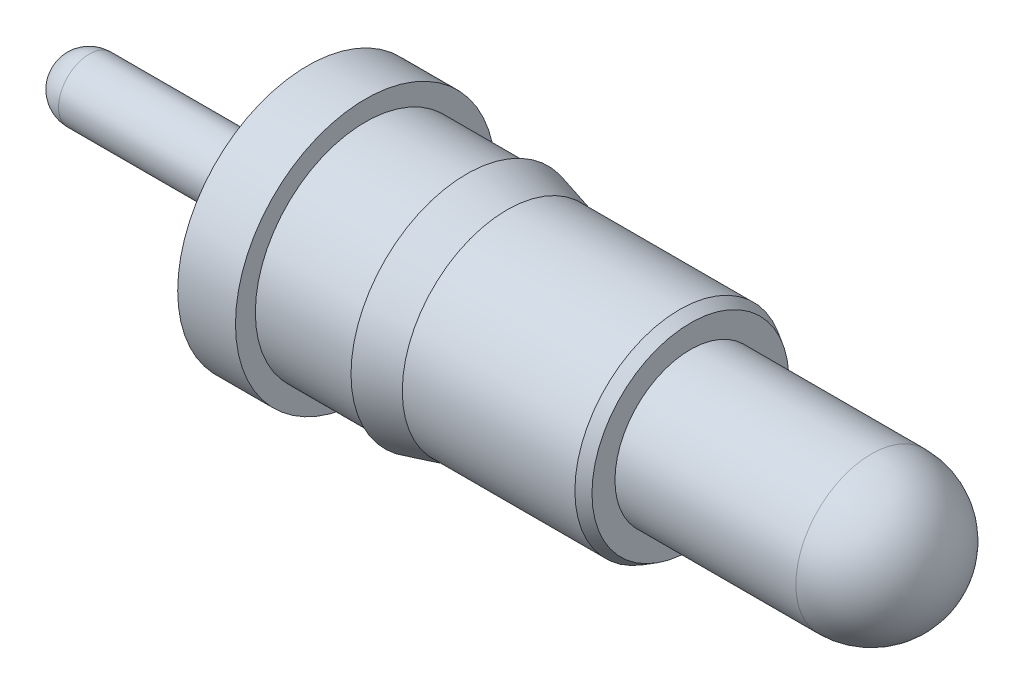
ISO-10303-21;
HEADER;
FILE_DESCRIPTION(('STEP AP214'),'2;1');
FILE_NAME('part.step','',(''),(''),'','','');
FILE_SCHEMA(('AUTOMOTIVE_DESIGN { 1 0 10303 214 1 1 1 1 }'));
ENDSEC;
DATA;
#1=APPLICATION_CONTEXT('core data for automotive mechanical design processes');
#2=APPLICATION_PROTOCOL_DEFINITION('international standard','automotive_design',2000,#1);
#3=PRODUCT_CONTEXT('',#1,'mechanical');
#4=PRODUCT('Part','Part','',(#3));
#5=PRODUCT_RELATED_PRODUCT_CATEGORY('part','',(#4));
#6=PRODUCT_DEFINITION_FORMATION('','',#4);
#7=PRODUCT_DEFINITION_CONTEXT('part definition',#1,'design');
#8=PRODUCT_DEFINITION('design','',#6,#7);
#9=PRODUCT_DEFINITION_SHAPE('','',#8);
#10=(LENGTH_UNIT() NAMED_UNIT(*) SI_UNIT(.MILLI.,.METRE.));
#11=(NAMED_UNIT(*) PLANE_ANGLE_UNIT() SI_UNIT($,.RADIAN.));
#12=(NAMED_UNIT(*) SI_UNIT($,.STERADIAN.) SOLID_ANGLE_UNIT());
#13=UNCERTAINTY_MEASURE_WITH_UNIT(LENGTH_MEASURE(1.E-05),#10,'distance_accuracy_value','');
#14=(GEOMETRIC_REPRESENTATION_CONTEXT(3) GLOBAL_UNCERTAINTY_ASSIGNED_CONTEXT((#13)) GLOBAL_UNIT_ASSIGNED_CONTEXT((#10,
#11,#12)) REPRESENTATION_CONTEXT('',''));
#15=CARTESIAN_POINT('',(0.,0.,0.));
#16=DIRECTION('',(0.,0.,1.));
#17=DIRECTION('',(1.,0.,0.));
#18=AXIS2_PLACEMENT_3D('',#15,#16,#17);
#19=CARTESIAN_POINT('',(0.215900000000005,0.,0.));
#20=DIRECTION('',(-1.,0.,0.));
#21=DIRECTION('',(0.,1.,0.));
#22=AXIS2_PLACEMENT_3D('',#19,#20,#21);
#23=SPHERICAL_SURFACE('',#22,0.215900000000005);
#24=CARTESIAN_POINT('',(0.215900000000005,0.,0.));
#25=DIRECTION('',(-1.,0.,0.));
#26=DIRECTION('',(0.,0.,1.));
#27=AXIS2_PLACEMENT_3D('',#24,#25,#26);
#28=CIRCLE('',#27,0.215900000000005);
#29=CARTESIAN_POINT('',(0.215900000000005,0.,0.215900000000005));
#30=VERTEX_POINT('',#29);
#31=EDGE_CURVE('E76',#30,#30,#28,.T.);
#32=ORIENTED_EDGE('',*,*,#31,.T.);
#33=EDGE_LOOP('',(#32));
#34=FACE_BOUND('',#33,.T.);
#35=ADVANCED_FACE('F33',(#34),#23,.T.);
#36=CARTESIAN_POINT('',(5.71754000000003,0.,0.));
#37=DIRECTION('',(-1.,0.,0.));
#38=DIRECTION('',(0.,1.,0.));
#39=AXIS2_PLACEMENT_3D('',#36,#37,#38);
#40=SPHERICAL_SURFACE('',#39,0.53086);
#41=CARTESIAN_POINT('',(5.71754000000003,0.,0.));
#42=DIRECTION('',(-1.,0.,0.));
#43=DIRECTION('',(0.,0.,1.));
#44=AXIS2_PLACEMENT_3D('',#41,#42,#43);
#45=CIRCLE('',#44,0.53086);
#46=CARTESIAN_POINT('',(5.71754000000003,0.,0.53086));
#47=VERTEX_POINT('',#46);
#48=EDGE_CURVE('E10',#47,#47,#45,.T.);
#49=ORIENTED_EDGE('',*,*,#48,.F.);
#50=EDGE_LOOP('',(#49));
#51=FACE_BOUND('',#50,.T.);
#52=ADVANCED_FACE('F148',(#51),#40,.T.);
#53=CARTESIAN_POINT('',(0.,0.,0.));
#54=DIRECTION('',(-1.,0.,0.));
#55=DIRECTION('',(0.,0.,1.));
#56=AXIS2_PLACEMENT_3D('',#53,#54,#55);
#57=CYLINDRICAL_SURFACE('',#56,0.53086);
#58=CARTESIAN_POINT('',(4.44500000000003,0.,0.));
#59=DIRECTION('',(-1.,0.,0.));
#60=DIRECTION('',(0.,0.,1.));
#61=AXIS2_PLACEMENT_3D('',#58,#59,#60);
#62=CIRCLE('',#61,0.53086);
#63=CARTESIAN_POINT('',(4.44500000000003,0.,0.53086));
#64=VERTEX_POINT('',#63);
#65=EDGE_CURVE('E39',#64,#64,#62,.T.);
#66=ORIENTED_EDGE('',*,*,#65,.F.);
#67=EDGE_LOOP('',(#66));
#68=FACE_BOUND('',#67,.T.);
#69=ORIENTED_EDGE('',*,*,#48,.T.);
#70=EDGE_LOOP('',(#69));
#71=FACE_BOUND('',#70,.T.);
#72=ADVANCED_FACE('F143',(#68,#71),#57,.T.);
#73=CARTESIAN_POINT('',(4.44500000000003,0.692605909487749,0.));
#74=DIRECTION('',(-1.,0.,0.));
#75=DIRECTION('',(0.,0.,1.));
#76=AXIS2_PLACEMENT_3D('',#73,#74,#75);
#77=PLANE('',#76);
#78=CARTESIAN_POINT('',(4.44500000000003,0.,0.));
#79=DIRECTION('',(-1.,0.,0.));
#80=DIRECTION('',(0.,0.,1.));
#81=AXIS2_PLACEMENT_3D('',#78,#79,#80);
#82=CIRCLE('',#81,0.692605909487749);
#83=CARTESIAN_POINT('',(4.44500000000003,0.,0.692605909487749));
#84=VERTEX_POINT('',#83);
#85=EDGE_CURVE('E43',#84,#84,#82,.T.);
#86=ORIENTED_EDGE('',*,*,#85,.F.);
#87=EDGE_LOOP('',(#86));
#88=FACE_BOUND('',#87,.T.);
#89=ORIENTED_EDGE('',*,*,#65,.T.);
#90=EDGE_LOOP('',(#89));
#91=FACE_BOUND('',#90,.T.);
#92=ADVANCED_FACE('F138',(#88,#91),#77,.F.);
#93=CARTESIAN_POINT('',(4.44500000000003,0.,0.));
#94=DIRECTION('',(-1.,0.,0.));
#95=DIRECTION('',(0.,0.,1.));
#96=AXIS2_PLACEMENT_3D('',#93,#94,#95);
#97=CONICAL_SURFACE('',#96,0.692605909487749,0.523598775598299);
#98=CARTESIAN_POINT('',(4.36880000000002,0.,0.));
#99=DIRECTION('',(-1.,0.,0.));
#100=DIRECTION('',(0.,0.,1.));
#101=AXIS2_PLACEMENT_3D('',#98,#99,#100);
#102=CIRCLE('',#101,0.7366);
#103=CARTESIAN_POINT('',(4.36880000000002,0.,0.7366));
#104=VERTEX_POINT('',#103);
#105=EDGE_CURVE('E47',#104,#104,#102,.T.);
#106=ORIENTED_EDGE('',*,*,#105,.F.);
#107=EDGE_LOOP('',(#106));
#108=FACE_BOUND('',#107,.T.);
#109=ORIENTED_EDGE('',*,*,#85,.T.);
#110=EDGE_LOOP('',(#109));
#111=FACE_BOUND('',#110,.T.);
#112=ADVANCED_FACE('F132',(#108,#111),#97,.T.);
#113=CARTESIAN_POINT('',(0.,0.,0.));
#114=DIRECTION('',(-1.,0.,0.));
#115=DIRECTION('',(0.,0.,1.));
#116=AXIS2_PLACEMENT_3D('',#113,#114,#115);
#117=CYLINDRICAL_SURFACE('',#116,0.7366);
#118=CARTESIAN_POINT('',(3.15458227153651,0.,0.));
#119=DIRECTION('',(-1.,0.,0.));
#120=DIRECTION('',(0.,0.,1.));
#121=AXIS2_PLACEMENT_3D('',#118,#119,#120);
#122=CIRCLE('',#121,0.7366);
#123=CARTESIAN_POINT('',(3.15458227153651,0.,0.7366));
#124=VERTEX_POINT('',#123);
#125=EDGE_CURVE('E52',#124,#124,#122,.T.);
#126=ORIENTED_EDGE('',*,*,#125,.F.);
#127=EDGE_LOOP('',(#126));
#128=FACE_BOUND('',#127,.T.);
#129=ORIENTED_EDGE('',*,*,#105,.T.);
#130=EDGE_LOOP('',(#129));
#131=FACE_BOUND('',#130,.T.);
#132=ADVANCED_FACE('F126',(#128,#131),#117,.T.);
#133=CARTESIAN_POINT('',(3.15458227153651,0.,0.));
#134=DIRECTION('',(-1.,0.,0.));
#135=DIRECTION('',(0.,0.,1.));
#136=AXIS2_PLACEMENT_3D('',#133,#134,#135);
#137=CONICAL_SURFACE('',#136,0.7366,0.261799387799376);
#138=CARTESIAN_POINT('',(2.87020000000002,0.,0.));
#139=DIRECTION('',(-1.,0.,0.));
#140=DIRECTION('',(0.,0.,1.));
#141=AXIS2_PLACEMENT_3D('',#138,#139,#140);
#142=CIRCLE('',#141,0.8128);
#143=CARTESIAN_POINT('',(2.87020000000002,0.,0.8128));
#144=VERTEX_POINT('',#143);
#145=EDGE_CURVE('E55',#144,#144,#142,.T.);
#146=ORIENTED_EDGE('',*,*,#145,.F.);
#147=EDGE_LOOP('',(#146));
#148=FACE_BOUND('',#147,.T.);
#149=ORIENTED_EDGE('',*,*,#125,.T.);
#150=EDGE_LOOP('',(#149));
#151=FACE_BOUND('',#150,.T.);
#152=ADVANCED_FACE('F120',(#148,#151),#137,.T.);
#153=CARTESIAN_POINT('',(2.87020000000002,0.7747,0.));
#154=DIRECTION('',(1.,0.,0.));
#155=DIRECTION('',(0.,0.,-1.));
#156=AXIS2_PLACEMENT_3D('',#153,#154,#155);
#157=PLANE('',#156);
#158=CARTESIAN_POINT('',(2.87020000000002,0.,0.));
#159=DIRECTION('',(-1.,0.,0.));
#160=DIRECTION('',(0.,0.,1.));
#161=AXIS2_PLACEMENT_3D('',#158,#159,#160);
#162=CIRCLE('',#161,0.7747);
#163=CARTESIAN_POINT('',(2.87020000000002,0.,0.7747));
#164=VERTEX_POINT('',#163);
#165=EDGE_CURVE('E58',#164,#164,#162,.T.);
#166=ORIENTED_EDGE('',*,*,#165,.F.);
#167=EDGE_LOOP('',(#166));
#168=FACE_BOUND('',#167,.T.);
#169=ORIENTED_EDGE('',*,*,#145,.T.);
#170=EDGE_LOOP('',(#169));
#171=FACE_BOUND('',#170,.T.);
#172=ADVANCED_FACE('F114',(#168,#171),#157,.F.);
#173=CARTESIAN_POINT('',(0.,0.,0.));
#174=DIRECTION('',(-1.,0.,0.));
#175=DIRECTION('',(0.,0.,1.));
#176=AXIS2_PLACEMENT_3D('',#173,#174,#175);
#177=CYLINDRICAL_SURFACE('',#176,0.7747);
#178=CARTESIAN_POINT('',(2.15900000000003,0.,0.));
#179=DIRECTION('',(-1.,0.,0.));
#180=DIRECTION('',(0.,0.,1.));
#181=AXIS2_PLACEMENT_3D('',#178,#179,#180);
#182=CIRCLE('',#181,0.7747);
#183=CARTESIAN_POINT('',(2.15900000000003,0.,0.7747));
#184=VERTEX_POINT('',#183);
#185=EDGE_CURVE('E61',#184,#184,#182,.T.);
#186=ORIENTED_EDGE('',*,*,#185,.F.);
#187=EDGE_LOOP('',(#186));
#188=FACE_BOUND('',#187,.T.);
#189=ORIENTED_EDGE('',*,*,#165,.T.);
#190=EDGE_LOOP('',(#189));
#191=FACE_BOUND('',#190,.T.);
#192=ADVANCED_FACE('F108',(#188,#191),#177,.T.);
#193=CARTESIAN_POINT('',(2.15900000000003,0.9144,0.));
#194=DIRECTION('',(-1.,0.,0.));
#195=DIRECTION('',(0.,0.,1.));
#196=AXIS2_PLACEMENT_3D('',#193,#194,#195);
#197=PLANE('',#196);
#198=CARTESIAN_POINT('',(2.15900000000003,0.,0.));
#199=DIRECTION('',(-1.,0.,0.));
#200=DIRECTION('',(0.,0.,1.));
#201=AXIS2_PLACEMENT_3D('',#198,#199,#200);
#202=CIRCLE('',#201,0.9144);
#203=CARTESIAN_POINT('',(2.15900000000003,0.,0.9144));
#204=VERTEX_POINT('',#203);
#205=EDGE_CURVE('E64',#204,#204,#202,.T.);
#206=ORIENTED_EDGE('',*,*,#205,.F.);
#207=EDGE_LOOP('',(#206));
#208=FACE_BOUND('',#207,.T.);
#209=ORIENTED_EDGE('',*,*,#185,.T.);
#210=EDGE_LOOP('',(#209));
#211=FACE_BOUND('',#210,.T.);
#212=ADVANCED_FACE('F102',(#208,#211),#197,.F.);
#213=CARTESIAN_POINT('',(0.,0.,0.));
#214=DIRECTION('',(-1.,0.,0.));
#215=DIRECTION('',(0.,0.,1.));
#216=AXIS2_PLACEMENT_3D('',#213,#214,#215);
#217=CYLINDRICAL_SURFACE('',#216,0.9144);
#218=CARTESIAN_POINT('',(1.75260000000003,0.,0.));
#219=DIRECTION('',(-1.,0.,0.));
#220=DIRECTION('',(0.,0.,1.));
#221=AXIS2_PLACEMENT_3D('',#218,#219,#220);
#222=CIRCLE('',#221,0.9144);
#223=CARTESIAN_POINT('',(1.75260000000003,0.,0.9144));
#224=VERTEX_POINT('',#223);
#225=EDGE_CURVE('E67',#224,#224,#222,.T.);
#226=ORIENTED_EDGE('',*,*,#225,.F.);
#227=EDGE_LOOP('',(#226));
#228=FACE_BOUND('',#227,.T.);
#229=ORIENTED_EDGE('',*,*,#205,.T.);
#230=EDGE_LOOP('',(#229));
#231=FACE_BOUND('',#230,.T.);
#232=ADVANCED_FACE('F96',(#228,#231),#217,.T.);
#233=CARTESIAN_POINT('',(1.75260000000003,0.9144,0.));
#234=DIRECTION('',(1.,0.,0.));
#235=DIRECTION('',(0.,0.,-1.));
#236=AXIS2_PLACEMENT_3D('',#233,#234,#235);
#237=PLANE('',#236);
#238=CARTESIAN_POINT('',(1.75260000000003,0.,0.));
#239=DIRECTION('',(-1.,0.,0.));
#240=DIRECTION('',(0.,0.,1.));
#241=AXIS2_PLACEMENT_3D('',#238,#239,#240);
#242=CIRCLE('',#241,0.292100000000005);
#243=CARTESIAN_POINT('',(1.75260000000003,0.,0.292100000000005));
#244=VERTEX_POINT('',#243);
#245=EDGE_CURVE('E70',#244,#244,#242,.T.);
#246=ORIENTED_EDGE('',*,*,#245,.F.);
#247=EDGE_LOOP('',(#246));
#248=FACE_BOUND('',#247,.T.);
#249=ORIENTED_EDGE('',*,*,#225,.T.);
#250=EDGE_LOOP('',(#249));
#251=FACE_BOUND('',#250,.T.);
#252=ADVANCED_FACE('F90',(#248,#251),#237,.F.);
#253=CARTESIAN_POINT('',(1.67640000000003,0.,0.));
#254=DIRECTION('',(-1.,0.,0.));
#255=DIRECTION('',(0.,0.,1.));
#256=AXIS2_PLACEMENT_3D('',#253,#254,#255);
#257=TOROIDAL_SURFACE('',#256,0.292100000000005,0.0762);
#258=CARTESIAN_POINT('',(1.67640000000003,0.,0.));
#259=DIRECTION('',(-1.,0.,0.));
#260=DIRECTION('',(0.,0.,1.));
#261=AXIS2_PLACEMENT_3D('',#258,#259,#260);
#262=CIRCLE('',#261,0.215900000000005);
#263=CARTESIAN_POINT('',(1.67640000000003,0.,0.215900000000005));
#264=VERTEX_POINT('',#263);
#265=EDGE_CURVE('E73',#264,#264,#262,.T.);
#266=ORIENTED_EDGE('',*,*,#265,.F.);
#267=EDGE_LOOP('',(#266));
#268=FACE_BOUND('',#267,.T.);
#269=ORIENTED_EDGE('',*,*,#245,.T.);
#270=EDGE_LOOP('',(#269));
#271=FACE_BOUND('',#270,.T.);
#272=ADVANCED_FACE('F84',(#268,#271),#257,.F.);
#273=CARTESIAN_POINT('',(0.,0.,0.));
#274=DIRECTION('',(-1.,0.,0.));
#275=DIRECTION('',(0.,0.,1.));
#276=AXIS2_PLACEMENT_3D('',#273,#274,#275);
#277=CYLINDRICAL_SURFACE('',#276,0.215900000000005);
#278=ORIENTED_EDGE('',*,*,#31,.F.);
#279=EDGE_LOOP('',(#278));
#280=FACE_BOUND('',#279,.T.);
#281=ORIENTED_EDGE('',*,*,#265,.T.);
#282=EDGE_LOOP('',(#281));
#283=FACE_BOUND('',#282,.T.);
#284=ADVANCED_FACE('F81',(#280,#283),#277,.T.);
#285=CLOSED_SHELL('',(#35,#52,#72,#92,#112,#132,#152,#172,#192,#212,#232,#252,#272,#284));
#286=MANIFOLD_SOLID_BREP('B2',#285);
#287=ADVANCED_BREP_SHAPE_REPRESENTATION('',(#18,#286),#14);
#288=SHAPE_DEFINITION_REPRESENTATION(#9,#287);
ENDSEC;
END-ISO-10303-21;
